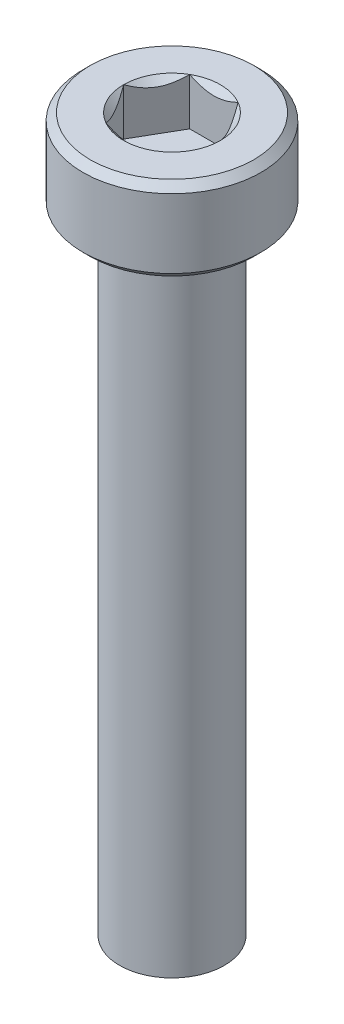
ISO-10303-21;
HEADER;
FILE_DESCRIPTION(('STEP AP214'),'2;1');
FILE_NAME('part.step','',(''),(''),'','','');
FILE_SCHEMA(('AUTOMOTIVE_DESIGN { 1 0 10303 214 1 1 1 1 }'));
ENDSEC;
DATA;
#1=APPLICATION_CONTEXT('core data for automotive mechanical design processes');
#2=APPLICATION_PROTOCOL_DEFINITION('international standard','automotive_design',2000,#1);
#3=PRODUCT_CONTEXT('',#1,'mechanical');
#4=PRODUCT('Part','Part','',(#3));
#5=PRODUCT_RELATED_PRODUCT_CATEGORY('part','',(#4));
#6=PRODUCT_DEFINITION_FORMATION('','',#4);
#7=PRODUCT_DEFINITION_CONTEXT('part definition',#1,'design');
#8=PRODUCT_DEFINITION('design','',#6,#7);
#9=PRODUCT_DEFINITION_SHAPE('','',#8);
#10=(LENGTH_UNIT() NAMED_UNIT(*) SI_UNIT(.MILLI.,.METRE.));
#11=(NAMED_UNIT(*) PLANE_ANGLE_UNIT() SI_UNIT($,.RADIAN.));
#12=(NAMED_UNIT(*) SI_UNIT($,.STERADIAN.) SOLID_ANGLE_UNIT());
#13=UNCERTAINTY_MEASURE_WITH_UNIT(LENGTH_MEASURE(1.E-05),#10,'distance_accuracy_value','');
#14=(GEOMETRIC_REPRESENTATION_CONTEXT(3) GLOBAL_UNCERTAINTY_ASSIGNED_CONTEXT((#13)) GLOBAL_UNIT_ASSIGNED_CONTEXT((#10,
#11,#12)) REPRESENTATION_CONTEXT('',''));
#15=CARTESIAN_POINT('',(0.,0.,0.));
#16=DIRECTION('',(0.,0.,1.));
#17=DIRECTION('',(1.,0.,0.));
#18=AXIS2_PLACEMENT_3D('',#15,#16,#17);
#19=CARTESIAN_POINT('',(0.,4.,0.));
#20=DIRECTION('',(0.,-1.,0.));
#21=DIRECTION('',(0.,0.,-1.));
#22=AXIS2_PLACEMENT_3D('',#19,#20,#21);
#23=CYLINDRICAL_SURFACE('',#22,4.25);
#24=CARTESIAN_POINT('',(0.,0.35,0.));
#25=DIRECTION('',(0.,1.,0.));
#26=DIRECTION('',(0.,0.,1.));
#27=AXIS2_PLACEMENT_3D('',#24,#25,#26);
#28=CIRCLE('',#27,4.25);
#29=CARTESIAN_POINT('',(0.,0.35,4.25));
#30=VERTEX_POINT('',#29);
#31=EDGE_CURVE('E192',#30,#30,#28,.T.);
#32=ORIENTED_EDGE('',*,*,#31,.T.);
#33=EDGE_LOOP('',(#32));
#34=FACE_BOUND('',#33,.T.);
#35=CARTESIAN_POINT('',(0.,3.65,0.));
#36=DIRECTION('',(0.,1.,0.));
#37=DIRECTION('',(0.,0.,1.));
#38=AXIS2_PLACEMENT_3D('',#35,#36,#37);
#39=CIRCLE('',#38,4.25);
#40=CARTESIAN_POINT('',(0.,3.65,4.25));
#41=VERTEX_POINT('',#40);
#42=EDGE_CURVE('E173',#41,#41,#39,.F.);
#43=ORIENTED_EDGE('',*,*,#42,.T.);
#44=EDGE_LOOP('',(#43));
#45=FACE_BOUND('',#44,.T.);
#46=ADVANCED_FACE('F32',(#34,#45),#23,.T.);
#47=CARTESIAN_POINT('',(0.,4.,0.));
#48=DIRECTION('',(0.,1.,0.));
#49=DIRECTION('',(0.,0.,1.));
#50=AXIS2_PLACEMENT_3D('',#47,#48,#49);
#51=PLANE('',#50);
#52=CARTESIAN_POINT('',(0.,4.,0.));
#53=DIRECTION('',(0.,1.,0.));
#54=DIRECTION('',(0.,0.,1.));
#55=AXIS2_PLACEMENT_3D('',#52,#53,#54);
#56=CIRCLE('',#55,3.9);
#57=CARTESIAN_POINT('',(0.,4.,3.9));
#58=VERTEX_POINT('',#57);
#59=EDGE_CURVE('E36',#58,#58,#56,.T.);
#60=ORIENTED_EDGE('',*,*,#59,.T.);
#61=EDGE_LOOP('',(#60));
#62=FACE_BOUND('',#61,.T.);
#63=CARTESIAN_POINT('',(0.,4.,0.));
#64=DIRECTION('',(0.,1.,0.));
#65=DIRECTION('',(0.,0.,1.));
#66=AXIS2_PLACEMENT_3D('',#63,#64,#65);
#67=CIRCLE('',#66,2.3094010767585);
#68=CARTESIAN_POINT('',(1.15470053837925,4.,2.));
#69=VERTEX_POINT('',#68);
#70=CARTESIAN_POINT('',(2.3094010767585,4.,0.));
#71=VERTEX_POINT('',#70);
#72=EDGE_CURVE('E47',#69,#71,#67,.T.);
#73=ORIENTED_EDGE('',*,*,#72,.F.);
#74=CARTESIAN_POINT('',(-1.15470053837925,4.,2.));
#75=VERTEX_POINT('',#74);
#76=EDGE_CURVE('E54',#75,#69,#67,.T.);
#77=ORIENTED_EDGE('',*,*,#76,.F.);
#78=CARTESIAN_POINT('',(-2.3094010767585,4.,0.));
#79=VERTEX_POINT('',#78);
#80=EDGE_CURVE('E221',#79,#75,#67,.T.);
#81=ORIENTED_EDGE('',*,*,#80,.F.);
#82=CARTESIAN_POINT('',(-1.15470053837925,4.,-2.));
#83=VERTEX_POINT('',#82);
#84=EDGE_CURVE('E275',#83,#79,#67,.T.);
#85=ORIENTED_EDGE('',*,*,#84,.F.);
#86=CARTESIAN_POINT('',(1.15470053837925,4.,-2.));
#87=VERTEX_POINT('',#86);
#88=EDGE_CURVE('E279',#87,#83,#67,.T.);
#89=ORIENTED_EDGE('',*,*,#88,.F.);
#90=EDGE_CURVE('E224',#71,#87,#67,.T.);
#91=ORIENTED_EDGE('',*,*,#90,.F.);
#92=EDGE_LOOP('',(#73,#77,#81,#85,#89,#91));
#93=FACE_BOUND('',#92,.T.);
#94=ADVANCED_FACE('F117',(#62,#93),#51,.T.);
#95=CARTESIAN_POINT('',(0.,0.,0.));
#96=DIRECTION('',(0.,1.,0.));
#97=DIRECTION('',(0.,0.,1.));
#98=AXIS2_PLACEMENT_3D('',#95,#96,#97);
#99=PLANE('',#98);
#100=CARTESIAN_POINT('',(0.,0.,0.));
#101=DIRECTION('',(0.,-1.,0.));
#102=DIRECTION('',(0.,0.,-1.));
#103=AXIS2_PLACEMENT_3D('',#100,#101,#102);
#104=CIRCLE('',#103,2.5);
#105=CARTESIAN_POINT('',(0.,0.,-2.5));
#106=VERTEX_POINT('',#105);
#107=EDGE_CURVE('E11',#106,#106,#104,.T.);
#108=ORIENTED_EDGE('',*,*,#107,.F.);
#109=EDGE_LOOP('',(#108));
#110=FACE_BOUND('',#109,.T.);
#111=CARTESIAN_POINT('',(0.,0.,0.));
#112=DIRECTION('',(0.,1.,0.));
#113=DIRECTION('',(0.,0.,1.));
#114=AXIS2_PLACEMENT_3D('',#111,#112,#113);
#115=CIRCLE('',#114,3.9);
#116=CARTESIAN_POINT('',(0.,0.,3.9));
#117=VERTEX_POINT('',#116);
#118=EDGE_CURVE('E193',#117,#117,#115,.F.);
#119=ORIENTED_EDGE('',*,*,#118,.T.);
#120=EDGE_LOOP('',(#119));
#121=FACE_BOUND('',#120,.T.);
#122=ADVANCED_FACE('F114',(#110,#121),#99,.F.);
#123=CARTESIAN_POINT('',(0.,4.,0.));
#124=DIRECTION('',(0.,1.,0.));
#125=DIRECTION('',(0.,0.,1.));
#126=AXIS2_PLACEMENT_3D('',#123,#124,#125);
#127=CONICAL_SURFACE('',#126,2.3094010767585,0.78539816339745);
#128=ORIENTED_EDGE('',*,*,#88,.T.);
#129=CARTESIAN_POINT('',(-2.30879514519547,4.7451913710941,-2.));
#130=CARTESIAN_POINT('',(-2.25260483420644,4.70272936243434,-2.));
#131=CARTESIAN_POINT('',(-2.19610054826954,4.66067688200341,-2.));
#132=CARTESIAN_POINT('',(-2.08233997644141,4.57757255324399,-2.));
#133=CARTESIAN_POINT('',(-2.02508350593089,4.53652095791472,-2.));
#134=CARTESIAN_POINT('',(-1.90927566541922,4.45530804643438,-2.));
#135=CARTESIAN_POINT('',(-1.85071770008489,4.41515609122241,-2.));
#136=CARTESIAN_POINT('',(-1.73260864093249,4.3363515847231,-2.));
#137=CARTESIAN_POINT('',(-1.67305761759535,4.29769892766731,-2.));
#138=CARTESIAN_POINT('',(-1.48577916730299,4.18010979954426,-2.));
#139=CARTESIAN_POINT('',(-1.35605368916015,4.10429897318513,-2.));
#140=CARTESIAN_POINT('',(-1.09012591699501,3.96558678933234,-2.));
#141=CARTESIAN_POINT('',(-0.953947448051695,3.90264190405374,-2.));
#142=CARTESIAN_POINT('',(-0.749595808101582,3.82563304479576,-2.));
#143=CARTESIAN_POINT('',(-0.68446185868507,3.80354078810321,-2.));
#144=CARTESIAN_POINT('',(-0.552616590705859,3.76458470124845,-2.));
#145=CARTESIAN_POINT('',(-0.485905164307167,3.74772122964342,-2.));
#146=CARTESIAN_POINT('',(-0.35242076182913,3.72038115809599,-2.));
#147=CARTESIAN_POINT('',(-0.285670630070522,3.70979477255778,-2.));
#148=CARTESIAN_POINT('',(-0.151450075115658,3.69521650264193,-2.));
#149=CARTESIAN_POINT('',(-0.0839797791079536,3.69122347258728,-2.));
#150=CARTESIAN_POINT('',(0.0485458836876959,3.69013056832569,-2.));
#151=CARTESIAN_POINT('',(0.113599297040325,3.69278385991794,-2.));
#152=CARTESIAN_POINT('',(0.243151501456514,3.7042913666304,-2.));
#153=CARTESIAN_POINT('',(0.307650238204749,3.71314618217543,-2.));
#154=CARTESIAN_POINT('',(0.436718068720302,3.73672255220297,-2.));
#155=CARTESIAN_POINT('',(0.501268607918767,3.75154414683371,-2.));
#156=CARTESIAN_POINT('',(0.62895874241765,3.78626456197787,-2.));
#157=CARTESIAN_POINT('',(0.692098453289582,3.80616296494129,-2.));
#158=CARTESIAN_POINT('',(0.890618825033236,3.87621951925558,-2.));
#159=CARTESIAN_POINT('',(1.02317938217928,3.9343452676672,-2.));
#160=CARTESIAN_POINT('',(1.28208571706617,4.06358808493712,-2.));
#161=CARTESIAN_POINT('',(1.40840705860453,4.1347517736225,-2.));
#162=CARTESIAN_POINT('',(1.59098608025607,4.245808104349,-2.));
#163=CARTESIAN_POINT('',(1.64922192266561,4.28251192905768,-2.));
#164=CARTESIAN_POINT('',(1.76469412690495,4.35747121364132,-2.));
#165=CARTESIAN_POINT('',(1.82193041260228,4.39572679097645,-2.));
#166=CARTESIAN_POINT('',(1.93507003138205,4.47318936346553,-2.));
#167=CARTESIAN_POINT('',(1.99098041312104,4.51238611495078,-2.));
#168=CARTESIAN_POINT('',(2.10203689890268,4.59181712257718,-2.));
#169=CARTESIAN_POINT('',(2.15718320893172,4.63205109038507,-2.));
#170=CARTESIAN_POINT('',(2.21200957179853,4.67270997847205,-2.));
#171=B_SPLINE_CURVE_WITH_KNOTS('',3,(#129,#130,#131,#132,#133,#134,#135,#136,#137,#138,#139,
#140,#141,#142,#143,#144,#145,#146,#147,#148,#149,#150,#151,#152,#153,#154,#155,#156,#157,#158,
#159,#160,#161,#162,#163,#164,#165,#166,#167,#168,#169,#170),.UNSPECIFIED.,.F.,.F.,(4,2,2,2,2,2,
2,2,2,2,2,2,2,2,2,2,2,2,2,2,4),(0.,0.211292968403538,0.422638804079875,0.635621962722851,
0.848590068976733,1.29896262331491,1.74778530247796,1.95394639565666,2.16012162294077,
2.36257550428405,2.56499420305935,2.76000764023076,2.95503996100237,3.15348829581996,
3.35192031420439,3.78488584147103,4.2194308621905,4.42592352930545,4.63243185619172,
4.83726388732872,5.04203957897375),.UNSPECIFIED.);
#172=EDGE_CURVE('E189',#87,#83,#171,.F.);
#173=ORIENTED_EDGE('',*,*,#172,.F.);
#174=EDGE_LOOP('',(#128,#173));
#175=FACE_BOUND('',#174,.T.);
#176=ADVANCED_FACE('F95',(#175),#127,.F.);
#177=ORIENTED_EDGE('',*,*,#84,.T.);
#178=CARTESIAN_POINT('',(-1.15458506832541,4.00011547871366,-2.0002));
#179=CARTESIAN_POINT('',(-1.19427965103065,3.96045309022559,-1.93144696596929));
#180=CARTESIAN_POINT('',(-1.23463799837204,3.92311998228416,-1.86154425786449));
#181=CARTESIAN_POINT('',(-1.31693321846145,3.85476368513614,-1.71900475544956));
#182=CARTESIAN_POINT('',(-1.35887791933134,3.82377853373722,-1.64635440243464));
#183=CARTESIAN_POINT('',(-1.44345742638069,3.77070021654414,-1.49985839894603));
#184=CARTESIAN_POINT('',(-1.48607068799507,3.74847362717661,-1.4260500647537));
#185=CARTESIAN_POINT('',(-1.57223542169503,3.71422881667508,-1.27680836816473));
#186=CARTESIAN_POINT('',(-1.61578426088223,3.70218502914413,-1.20137956608185));
#187=CARTESIAN_POINT('',(-1.69083694766536,3.69131851190557,-1.07138449932892));
#188=CARTESIAN_POINT('',(-1.72224381117151,3.68970975360997,-1.01698621602989));
#189=CARTESIAN_POINT('',(-1.78500621460364,3.69241887759871,-0.908278544480304));
#190=CARTESIAN_POINT('',(-1.81636173267754,3.69673883775797,-0.853969194078659));
#191=CARTESIAN_POINT('',(-1.87877671565355,3.71105956740991,-0.74586327241066));
#192=CARTESIAN_POINT('',(-1.90983580972306,3.72106669276201,-0.692067343445206));
#193=CARTESIAN_POINT('',(-1.97141691651548,3.74621243024966,-0.585405737694424));
#194=CARTESIAN_POINT('',(-2.00193897021859,3.76135064904224,-0.532539989929285));
#195=CARTESIAN_POINT('',(-2.08012358375727,3.80629450342919,-0.397120266910154));
#196=CARTESIAN_POINT('',(-2.12730124240478,3.83948883942582,-0.315406165150521));
#197=CARTESIAN_POINT('',(-2.19667172615922,3.89552582317137,-0.195252962742198));
#198=CARTESIAN_POINT('',(-2.21953238052245,3.91521470294694,-0.155657147890823));
#199=CARTESIAN_POINT('',(-2.26483018959123,3.95638731836487,-0.0771990411121286));
#200=CARTESIAN_POINT('',(-2.28726759416161,3.97786995165125,-0.0383363164062609));
#201=CARTESIAN_POINT('',(-2.30951654681234,4.00011547871366,0.000199999999998398));
#202=B_SPLINE_CURVE_WITH_KNOTS('',3,(#178,#179,#180,#181,#182,#183,#184,#185,#186,#187,#188,
#189,#190,#191,#192,#193,#194,#195,#196,#197,#198,#199,#200,#201),.UNSPECIFIED.,.F.,.F.,(4,2,2,
2,2,2,2,2,2,2,2,4),(0.,0.266420613771064,0.534393751523389,0.798110374376916,1.06116288956937,
1.24939906803722,1.43770123566248,1.62621426093932,1.81471283831913,2.11415604834145,
2.2634717071779,2.4126962696977),.UNSPECIFIED.);
#203=EDGE_CURVE('E231',#83,#79,#202,.T.);
#204=ORIENTED_EDGE('',*,*,#203,.F.);
#205=EDGE_LOOP('',(#177,#204));
#206=FACE_BOUND('',#205,.T.);
#207=ADVANCED_FACE('F113',(#206),#127,.F.);
#208=ORIENTED_EDGE('',*,*,#80,.T.);
#209=CARTESIAN_POINT('',(-2.30951654681234,4.00011547871366,-0.000200000000001262));
#210=CARTESIAN_POINT('',(-2.26982196410711,3.96045309022559,0.0685530340307045));
#211=CARTESIAN_POINT('',(-2.22946361676572,3.92311998228416,0.138455742135511));
#212=CARTESIAN_POINT('',(-2.1471683966763,3.85476368513614,0.280995244550435));
#213=CARTESIAN_POINT('',(-2.10522369580642,3.82377853373722,0.353645597565357));
#214=CARTESIAN_POINT('',(-2.02064418875706,3.77070021654414,0.50014160105397));
#215=CARTESIAN_POINT('',(-1.97803092714269,3.74847362717661,0.573949935246294));
#216=CARTESIAN_POINT('',(-1.89186619344273,3.71422881667508,0.723191631835263));
#217=CARTESIAN_POINT('',(-1.84831735425552,3.70218502914413,0.798620433918151));
#218=CARTESIAN_POINT('',(-1.7732646674724,3.69131851190557,0.928615500671078));
#219=CARTESIAN_POINT('',(-1.74185780396625,3.68970975360997,0.983013783970107));
#220=CARTESIAN_POINT('',(-1.67909540053412,3.69241887759871,1.09172145551969));
#221=CARTESIAN_POINT('',(-1.64773988246021,3.69673883775797,1.14603080592134));
#222=CARTESIAN_POINT('',(-1.5853248994842,3.7110595674099,1.25413672758934));
#223=CARTESIAN_POINT('',(-1.55426580541469,3.721066692762,1.30793265655479));
#224=CARTESIAN_POINT('',(-1.49268469862228,3.74621243024966,1.41459426230557));
#225=CARTESIAN_POINT('',(-1.46216264491917,3.76135064904224,1.46746001007071));
#226=CARTESIAN_POINT('',(-1.38397803138049,3.80629450342919,1.60287973308984));
#227=CARTESIAN_POINT('',(-1.33680037273297,3.83948883942582,1.68459383484948));
#228=CARTESIAN_POINT('',(-1.26742988897853,3.89552582317137,1.8047470372578));
#229=CARTESIAN_POINT('',(-1.24456923461531,3.91521470294694,1.84434285210918));
#230=CARTESIAN_POINT('',(-1.19927142554652,3.95638731836487,1.92280095888787));
#231=CARTESIAN_POINT('',(-1.17683402097614,3.97786995165125,1.96166368359374));
#232=CARTESIAN_POINT('',(-1.15458506832541,4.00011547871366,2.0002));
#233=B_SPLINE_CURVE_WITH_KNOTS('',3,(#209,#210,#211,#212,#213,#214,#215,#216,#217,#218,#219,
#220,#221,#222,#223,#224,#225,#226,#227,#228,#229,#230,#231,#232),.UNSPECIFIED.,.F.,.F.,(4,2,2,
2,2,2,2,2,2,2,2,4),(0.,0.266420613771064,0.534393751523389,0.798110374376915,1.06116288956936,
1.24939906803722,1.43770123566247,1.62621426093932,1.81471283831913,2.11415604834145,
2.26347170717791,2.41269626969771),.UNSPECIFIED.);
#234=EDGE_CURVE('E238',#79,#75,#233,.T.);
#235=ORIENTED_EDGE('',*,*,#234,.F.);
#236=EDGE_LOOP('',(#208,#235));
#237=FACE_BOUND('',#236,.T.);
#238=ADVANCED_FACE('F273',(#237),#127,.F.);
#239=ORIENTED_EDGE('',*,*,#76,.T.);
#240=CARTESIAN_POINT('',(-2.30879514519547,4.7451913710941,2.));
#241=CARTESIAN_POINT('',(-2.25260483420644,4.70272936243434,2.));
#242=CARTESIAN_POINT('',(-2.19610054826953,4.66067688200341,2.));
#243=CARTESIAN_POINT('',(-2.0823399764414,4.57757255324399,2.));
#244=CARTESIAN_POINT('',(-2.02508350593089,4.53652095791471,2.));
#245=CARTESIAN_POINT('',(-1.90927566541922,4.45530804643438,2.));
#246=CARTESIAN_POINT('',(-1.85071770008489,4.41515609122241,2.));
#247=CARTESIAN_POINT('',(-1.73260864093249,4.3363515847231,2.));
#248=CARTESIAN_POINT('',(-1.67305761759535,4.29769892766731,2.));
#249=CARTESIAN_POINT('',(-1.48577916730299,4.18010979954426,2.));
#250=CARTESIAN_POINT('',(-1.35605368916015,4.10429897318513,2.));
#251=CARTESIAN_POINT('',(-1.09012591699501,3.96558678933234,2.));
#252=CARTESIAN_POINT('',(-0.953947448051694,3.90264190405374,2.));
#253=CARTESIAN_POINT('',(-0.749595808101582,3.82563304479576,2.));
#254=CARTESIAN_POINT('',(-0.68446185868507,3.80354078810321,2.));
#255=CARTESIAN_POINT('',(-0.552616590705859,3.76458470124845,2.));
#256=CARTESIAN_POINT('',(-0.485905164307167,3.74772122964342,2.));
#257=CARTESIAN_POINT('',(-0.352420761829129,3.72038115809599,2.));
#258=CARTESIAN_POINT('',(-0.285670630070522,3.70979477255778,2.));
#259=CARTESIAN_POINT('',(-0.151450075115657,3.69521650264193,2.));
#260=CARTESIAN_POINT('',(-0.0839797791079529,3.69122347258728,2.));
#261=CARTESIAN_POINT('',(0.0485458836876966,3.69013056832569,2.));
#262=CARTESIAN_POINT('',(0.113599297040325,3.69278385991794,2.));
#263=CARTESIAN_POINT('',(0.243151501456515,3.7042913666304,2.));
#264=CARTESIAN_POINT('',(0.307650238204749,3.71314618217543,2.));
#265=CARTESIAN_POINT('',(0.436718068720302,3.73672255220297,2.));
#266=CARTESIAN_POINT('',(0.501268607918768,3.75154414683371,2.));
#267=CARTESIAN_POINT('',(0.62895874241765,3.78626456197787,2.));
#268=CARTESIAN_POINT('',(0.692098453289583,3.80616296494129,2.));
#269=CARTESIAN_POINT('',(0.890618825033236,3.87621951925558,2.));
#270=CARTESIAN_POINT('',(1.02317938217928,3.9343452676672,2.));
#271=CARTESIAN_POINT('',(1.28208571706617,4.06358808493712,2.));
#272=CARTESIAN_POINT('',(1.40840705860453,4.1347517736225,2.));
#273=CARTESIAN_POINT('',(1.59098608025607,4.24580810434899,2.));
#274=CARTESIAN_POINT('',(1.64922192266561,4.28251192905768,2.));
#275=CARTESIAN_POINT('',(1.76469412690495,4.35747121364132,2.));
#276=CARTESIAN_POINT('',(1.82193041260228,4.39572679097644,2.));
#277=CARTESIAN_POINT('',(1.93507003138205,4.47318936346553,2.));
#278=CARTESIAN_POINT('',(1.99098041312104,4.51238611495078,2.));
#279=CARTESIAN_POINT('',(2.10203689890268,4.59181712257718,2.));
#280=CARTESIAN_POINT('',(2.15718320893172,4.63205109038507,2.));
#281=CARTESIAN_POINT('',(2.21200957179853,4.67270997847205,2.));
#282=B_SPLINE_CURVE_WITH_KNOTS('',3,(#240,#241,#242,#243,#244,#245,#246,#247,#248,#249,#250,
#251,#252,#253,#254,#255,#256,#257,#258,#259,#260,#261,#262,#263,#264,#265,#266,#267,#268,#269,
#270,#271,#272,#273,#274,#275,#276,#277,#278,#279,#280,#281),.UNSPECIFIED.,.F.,.F.,(4,2,2,2,2,2,
2,2,2,2,2,2,2,2,2,2,2,2,2,2,4),(0.,0.211292968403538,0.422638804079876,0.63562196272285,
0.848590068976733,1.29896262331491,1.74778530247796,1.95394639565666,2.16012162294077,
2.36257550428405,2.56499420305935,2.76000764023076,2.95503996100237,3.15348829581996,
3.35192031420438,3.78488584147103,4.2194308621905,4.42592352930545,4.63243185619172,
4.83726388732871,5.04203957897375),.UNSPECIFIED.);
#283=EDGE_CURVE('E258',#75,#69,#282,.T.);
#284=ORIENTED_EDGE('',*,*,#283,.F.);
#285=EDGE_LOOP('',(#239,#284));
#286=FACE_BOUND('',#285,.T.);
#287=ADVANCED_FACE('F272',(#286),#127,.F.);
#288=ORIENTED_EDGE('',*,*,#72,.T.);
#289=CARTESIAN_POINT('',(1.15458506832541,4.00011547871366,2.0002));
#290=CARTESIAN_POINT('',(1.19427965103064,3.96045309022559,1.93144696596929));
#291=CARTESIAN_POINT('',(1.23463799837204,3.92311998228416,1.86154425786449));
#292=CARTESIAN_POINT('',(1.31693321846145,3.85476368513614,1.71900475544956));
#293=CARTESIAN_POINT('',(1.35887791933134,3.82377853373722,1.64635440243464));
#294=CARTESIAN_POINT('',(1.44345742638069,3.77070021654414,1.49985839894603));
#295=CARTESIAN_POINT('',(1.48607068799507,3.74847362717661,1.42605006475371));
#296=CARTESIAN_POINT('',(1.57223542169503,3.71422881667508,1.27680836816474));
#297=CARTESIAN_POINT('',(1.61578426088223,3.70218502914413,1.20137956608185));
#298=CARTESIAN_POINT('',(1.69083694766536,3.69131851190557,1.07138449932892));
#299=CARTESIAN_POINT('',(1.72224381117151,3.68970975360997,1.01698621602989));
#300=CARTESIAN_POINT('',(1.78500621460364,3.69241887759871,0.908278544480306));
#301=CARTESIAN_POINT('',(1.81636173267754,3.69673883775797,0.85396919407866));
#302=CARTESIAN_POINT('',(1.87877671565355,3.71105956740991,0.745863272410661));
#303=CARTESIAN_POINT('',(1.90983580972306,3.72106669276201,0.692067343445207));
#304=CARTESIAN_POINT('',(1.97141691651548,3.74621243024966,0.585405737694425));
#305=CARTESIAN_POINT('',(2.00193897021859,3.76135064904224,0.532539989929286));
#306=CARTESIAN_POINT('',(2.08012358375727,3.80629450342919,0.397120266910155));
#307=CARTESIAN_POINT('',(2.12730124240478,3.83948883942582,0.315406165150521));
#308=CARTESIAN_POINT('',(2.19667172615922,3.89552582317137,0.195252962742197));
#309=CARTESIAN_POINT('',(2.21953238052245,3.91521470294694,0.155657147890823));
#310=CARTESIAN_POINT('',(2.26483018959124,3.95638731836487,0.0771990411121278));
#311=CARTESIAN_POINT('',(2.28726759416161,3.97786995165125,0.0383363164062597));
#312=CARTESIAN_POINT('',(2.30951654681234,4.00011547871366,-0.000200000000000139));
#313=B_SPLINE_CURVE_WITH_KNOTS('',3,(#289,#290,#291,#292,#293,#294,#295,#296,#297,#298,#299,
#300,#301,#302,#303,#304,#305,#306,#307,#308,#309,#310,#311,#312),.UNSPECIFIED.,.F.,.F.,(4,2,2,
2,2,2,2,2,2,2,2,4),(0.,0.266420613771064,0.534393751523389,0.798110374376915,1.06116288956936,
1.24939906803722,1.43770123566248,1.62621426093932,1.81471283831913,2.11415604834145,
2.2634717071779,2.41269626969771),.UNSPECIFIED.);
#314=EDGE_CURVE('E145',#69,#71,#313,.T.);
#315=ORIENTED_EDGE('',*,*,#314,.F.);
#316=EDGE_LOOP('',(#288,#315));
#317=FACE_BOUND('',#316,.T.);
#318=ADVANCED_FACE('F110',(#317),#127,.F.);
#319=ORIENTED_EDGE('',*,*,#90,.T.);
#320=CARTESIAN_POINT('',(2.30951654681234,4.00011547871366,0.000199999999999522));
#321=CARTESIAN_POINT('',(2.26982196410711,3.96045309022559,-0.0685530340307061));
#322=CARTESIAN_POINT('',(2.22946361676572,3.92311998228416,-0.138455742135512));
#323=CARTESIAN_POINT('',(2.1471683966763,3.85476368513614,-0.280995244550437));
#324=CARTESIAN_POINT('',(2.10522369580642,3.82377853373722,-0.353645597565359));
#325=CARTESIAN_POINT('',(2.02064418875706,3.77070021654414,-0.500141601053972));
#326=CARTESIAN_POINT('',(1.97803092714269,3.74847362717661,-0.573949935246295));
#327=CARTESIAN_POINT('',(1.89186619344273,3.71422881667508,-0.723191631835264));
#328=CARTESIAN_POINT('',(1.84831735425552,3.70218502914413,-0.798620433918152));
#329=CARTESIAN_POINT('',(1.7732646674724,3.69131851190557,-0.928615500671079));
#330=CARTESIAN_POINT('',(1.74185780396625,3.68970975360997,-0.983013783970109));
#331=CARTESIAN_POINT('',(1.67909540053412,3.69241887759871,-1.09172145551969));
#332=CARTESIAN_POINT('',(1.64773988246021,3.69673883775797,-1.14603080592134));
#333=CARTESIAN_POINT('',(1.5853248994842,3.71105956740991,-1.25413672758934));
#334=CARTESIAN_POINT('',(1.55426580541469,3.72106669276201,-1.30793265655479));
#335=CARTESIAN_POINT('',(1.49268469862228,3.74621243024966,-1.41459426230557));
#336=CARTESIAN_POINT('',(1.46216264491917,3.76135064904224,-1.46746001007071));
#337=CARTESIAN_POINT('',(1.38397803138049,3.80629450342919,-1.60287973308984));
#338=CARTESIAN_POINT('',(1.33680037273297,3.83948883942582,-1.68459383484948));
#339=CARTESIAN_POINT('',(1.26742988897853,3.89552582317137,-1.8047470372578));
#340=CARTESIAN_POINT('',(1.24456923461531,3.91521470294694,-1.84434285210918));
#341=CARTESIAN_POINT('',(1.19927142554652,3.95638731836487,-1.92280095888787));
#342=CARTESIAN_POINT('',(1.17683402097614,3.97786995165125,-1.96166368359374));
#343=CARTESIAN_POINT('',(1.15458506832541,4.00011547871366,-2.0002));
#344=B_SPLINE_CURVE_WITH_KNOTS('',3,(#320,#321,#322,#323,#324,#325,#326,#327,#328,#329,#330,
#331,#332,#333,#334,#335,#336,#337,#338,#339,#340,#341,#342,#343),.UNSPECIFIED.,.F.,.F.,(4,2,2,
2,2,2,2,2,2,2,2,4),(0.,0.266420613771064,0.534393751523388,0.798110374376914,1.06116288956936,
1.24939906803722,1.43770123566247,1.62621426093932,1.81471283831913,2.11415604834145,
2.2634717071779,2.41269626969771),.UNSPECIFIED.);
#345=EDGE_CURVE('E136',#71,#87,#344,.T.);
#346=ORIENTED_EDGE('',*,*,#345,.F.);
#347=EDGE_LOOP('',(#319,#346));
#348=FACE_BOUND('',#347,.T.);
#349=ADVANCED_FACE('F94',(#348),#127,.F.);
#350=CARTESIAN_POINT('',(0.,1.75,0.));
#351=DIRECTION('',(0.,1.,0.));
#352=DIRECTION('',(0.,0.,1.));
#353=AXIS2_PLACEMENT_3D('',#350,#351,#352);
#354=PLANE('',#353);
#355=CARTESIAN_POINT('',(0.,1.75,0.));
#356=DIRECTION('',(0.,1.,0.));
#357=DIRECTION('',(0.,0.,1.));
#358=AXIS2_PLACEMENT_3D('',#355,#356,#357);
#359=CIRCLE('',#358,0.059401076758495);
#360=CARTESIAN_POINT('',(0.,1.75,0.059401076758495));
#361=VERTEX_POINT('',#360);
#362=EDGE_CURVE('E187',#361,#361,#359,.T.);
#363=ORIENTED_EDGE('',*,*,#362,.F.);
#364=EDGE_LOOP('',(#363));
#365=FACE_BOUND('',#364,.T.);
#366=DIRECTION('',(-0.5,0.,-0.866025403784439));
#367=VECTOR('',#366,1.);
#368=CARTESIAN_POINT('',(2.3094010767585,1.75,0.));
#369=LINE('',#368,#367);
#370=CARTESIAN_POINT('',(2.3094010767585,1.75,0.));
#371=VERTEX_POINT('',#370);
#372=CARTESIAN_POINT('',(1.15470053837925,1.75,-2.));
#373=VERTEX_POINT('',#372);
#374=EDGE_CURVE('E144',#371,#373,#369,.T.);
#375=ORIENTED_EDGE('',*,*,#374,.T.);
#376=DIRECTION('',(-1.,0.,0.));
#377=VECTOR('',#376,1.);
#378=CARTESIAN_POINT('',(1.15470053837925,1.75,-2.));
#379=LINE('',#378,#377);
#380=CARTESIAN_POINT('',(-1.15470053837925,1.75,-2.));
#381=VERTEX_POINT('',#380);
#382=EDGE_CURVE('E154',#373,#381,#379,.T.);
#383=ORIENTED_EDGE('',*,*,#382,.T.);
#384=DIRECTION('',(-0.5,0.,0.866025403784439));
#385=VECTOR('',#384,1.);
#386=CARTESIAN_POINT('',(-1.15470053837925,1.75,-2.));
#387=LINE('',#386,#385);
#388=CARTESIAN_POINT('',(-2.3094010767585,1.75,0.));
#389=VERTEX_POINT('',#388);
#390=EDGE_CURVE('E157',#381,#389,#387,.T.);
#391=ORIENTED_EDGE('',*,*,#390,.T.);
#392=DIRECTION('',(0.5,0.,0.866025403784439));
#393=VECTOR('',#392,1.);
#394=CARTESIAN_POINT('',(-2.3094010767585,1.75,0.));
#395=LINE('',#394,#393);
#396=CARTESIAN_POINT('',(-1.15470053837925,1.75,2.));
#397=VERTEX_POINT('',#396);
#398=EDGE_CURVE('E160',#389,#397,#395,.T.);
#399=ORIENTED_EDGE('',*,*,#398,.T.);
#400=DIRECTION('',(1.,0.,0.));
#401=VECTOR('',#400,1.);
#402=CARTESIAN_POINT('',(-1.15470053837925,1.75,2.));
#403=LINE('',#402,#401);
#404=CARTESIAN_POINT('',(1.15470053837925,1.75,2.));
#405=VERTEX_POINT('',#404);
#406=EDGE_CURVE('E163',#397,#405,#403,.T.);
#407=ORIENTED_EDGE('',*,*,#406,.T.);
#408=DIRECTION('',(0.5,0.,-0.866025403784439));
#409=VECTOR('',#408,1.);
#410=CARTESIAN_POINT('',(1.15470053837925,1.75,2.));
#411=LINE('',#410,#409);
#412=EDGE_CURVE('E166',#405,#371,#411,.T.);
#413=ORIENTED_EDGE('',*,*,#412,.T.);
#414=EDGE_LOOP('',(#375,#383,#391,#399,#407,#413));
#415=FACE_BOUND('',#414,.T.);
#416=ADVANCED_FACE('F109',(#365,#415),#354,.T.);
#417=CARTESIAN_POINT('',(1.15470053837925,1.75,-2.));
#418=DIRECTION('',(0.,0.,-1.));
#419=DIRECTION('',(-1.,0.,0.));
#420=AXIS2_PLACEMENT_3D('',#417,#418,#419);
#421=PLANE('',#420);
#422=DIRECTION('',(0.,1.,0.));
#423=VECTOR('',#422,1.);
#424=CARTESIAN_POINT('',(1.15470053837925,1.75,-2.));
#425=LINE('',#424,#423);
#426=EDGE_CURVE('E169',#373,#87,#425,.T.);
#427=ORIENTED_EDGE('',*,*,#426,.T.);
#428=ORIENTED_EDGE('',*,*,#172,.T.);
#429=DIRECTION('',(0.,1.,0.));
#430=VECTOR('',#429,1.);
#431=CARTESIAN_POINT('',(-1.15470053837925,1.75,-2.));
#432=LINE('',#431,#430);
#433=EDGE_CURVE('E182',#381,#83,#432,.T.);
#434=ORIENTED_EDGE('',*,*,#433,.F.);
#435=ORIENTED_EDGE('',*,*,#382,.F.);
#436=EDGE_LOOP('',(#427,#428,#434,#435));
#437=FACE_BOUND('',#436,.T.);
#438=ADVANCED_FACE('F132',(#437),#421,.F.);
#439=CARTESIAN_POINT('',(-1.15470053837925,1.75,-2.));
#440=DIRECTION('',(-0.866025403784439,0.,-0.5));
#441=DIRECTION('',(-0.5,0.,0.866025403784439));
#442=AXIS2_PLACEMENT_3D('',#439,#440,#441);
#443=PLANE('',#442);
#444=ORIENTED_EDGE('',*,*,#433,.T.);
#445=ORIENTED_EDGE('',*,*,#203,.T.);
#446=DIRECTION('',(0.,1.,0.));
#447=VECTOR('',#446,1.);
#448=CARTESIAN_POINT('',(-2.3094010767585,1.75,0.));
#449=LINE('',#448,#447);
#450=EDGE_CURVE('E179',#389,#79,#449,.T.);
#451=ORIENTED_EDGE('',*,*,#450,.F.);
#452=ORIENTED_EDGE('',*,*,#390,.F.);
#453=EDGE_LOOP('',(#444,#445,#451,#452));
#454=FACE_BOUND('',#453,.T.);
#455=ADVANCED_FACE('F244',(#454),#443,.F.);
#456=CARTESIAN_POINT('',(-2.3094010767585,1.75,0.));
#457=DIRECTION('',(-0.866025403784439,0.,0.5));
#458=DIRECTION('',(0.5,0.,0.866025403784439));
#459=AXIS2_PLACEMENT_3D('',#456,#457,#458);
#460=PLANE('',#459);
#461=ORIENTED_EDGE('',*,*,#450,.T.);
#462=ORIENTED_EDGE('',*,*,#234,.T.);
#463=DIRECTION('',(0.,1.,0.));
#464=VECTOR('',#463,1.);
#465=CARTESIAN_POINT('',(-1.15470053837925,1.75,2.));
#466=LINE('',#465,#464);
#467=EDGE_CURVE('E177',#397,#75,#466,.T.);
#468=ORIENTED_EDGE('',*,*,#467,.F.);
#469=ORIENTED_EDGE('',*,*,#398,.F.);
#470=EDGE_LOOP('',(#461,#462,#468,#469));
#471=FACE_BOUND('',#470,.T.);
#472=ADVANCED_FACE('F247',(#471),#460,.F.);
#473=CARTESIAN_POINT('',(-1.15470053837925,1.75,2.));
#474=DIRECTION('',(0.,0.,1.));
#475=DIRECTION('',(1.,0.,0.));
#476=AXIS2_PLACEMENT_3D('',#473,#474,#475);
#477=PLANE('',#476);
#478=ORIENTED_EDGE('',*,*,#467,.T.);
#479=ORIENTED_EDGE('',*,*,#283,.T.);
#480=DIRECTION('',(0.,1.,0.));
#481=VECTOR('',#480,1.);
#482=CARTESIAN_POINT('',(1.15470053837925,1.75,2.));
#483=LINE('',#482,#481);
#484=EDGE_CURVE('E174',#405,#69,#483,.T.);
#485=ORIENTED_EDGE('',*,*,#484,.F.);
#486=ORIENTED_EDGE('',*,*,#406,.F.);
#487=EDGE_LOOP('',(#478,#479,#485,#486));
#488=FACE_BOUND('',#487,.T.);
#489=ADVANCED_FACE('F252',(#488),#477,.F.);
#490=CARTESIAN_POINT('',(1.15470053837925,1.75,2.));
#491=DIRECTION('',(0.866025403784439,0.,0.5));
#492=DIRECTION('',(0.5,0.,-0.866025403784439));
#493=AXIS2_PLACEMENT_3D('',#490,#491,#492);
#494=PLANE('',#493);
#495=ORIENTED_EDGE('',*,*,#484,.T.);
#496=ORIENTED_EDGE('',*,*,#314,.T.);
#497=DIRECTION('',(0.,1.,0.));
#498=VECTOR('',#497,1.);
#499=CARTESIAN_POINT('',(2.3094010767585,1.75,0.));
#500=LINE('',#499,#498);
#501=EDGE_CURVE('E170',#371,#71,#500,.T.);
#502=ORIENTED_EDGE('',*,*,#501,.F.);
#503=ORIENTED_EDGE('',*,*,#412,.F.);
#504=EDGE_LOOP('',(#495,#496,#502,#503));
#505=FACE_BOUND('',#504,.T.);
#506=ADVANCED_FACE('F101',(#505),#494,.F.);
#507=CARTESIAN_POINT('',(2.3094010767585,1.75,0.));
#508=DIRECTION('',(0.866025403784439,0.,-0.5));
#509=DIRECTION('',(-0.5,0.,-0.866025403784439));
#510=AXIS2_PLACEMENT_3D('',#507,#508,#509);
#511=PLANE('',#510);
#512=ORIENTED_EDGE('',*,*,#501,.T.);
#513=ORIENTED_EDGE('',*,*,#345,.T.);
#514=ORIENTED_EDGE('',*,*,#426,.F.);
#515=ORIENTED_EDGE('',*,*,#374,.F.);
#516=EDGE_LOOP('',(#512,#513,#514,#515));
#517=FACE_BOUND('',#516,.T.);
#518=ADVANCED_FACE('F91',(#517),#511,.F.);
#519=ORIENTED_EDGE('',*,*,#362,.T.);
#520=EDGE_LOOP('',(#519));
#521=FACE_BOUND('',#520,.T.);
#522=CARTESIAN_POINT('',(0.,1.69059892324151,0.));
#523=VERTEX_POINT('',#522);
#524=VERTEX_LOOP('',#523);
#525=FACE_BOUND('',#524,.T.);
#526=ADVANCED_FACE('F88',(#521,#525),#127,.F.);
#527=CARTESIAN_POINT('',(0.,0.35,0.));
#528=DIRECTION('',(0.,1.,0.));
#529=DIRECTION('',(0.,0.,1.));
#530=AXIS2_PLACEMENT_3D('',#527,#528,#529);
#531=CONICAL_SURFACE('',#530,4.25,0.78539816339745);
#532=CARTESIAN_POINT('',(0.,0.,3.9));
#533=CARTESIAN_POINT('',(0.,0.00364583333333348,3.90364583333333));
#534=CARTESIAN_POINT('',(0.,0.00729166666666674,3.90729166666667));
#535=CARTESIAN_POINT('',(0.,0.0145833333333333,3.91458333333333));
#536=CARTESIAN_POINT('',(0.,0.0182291666666665,3.91822916666667));
#537=CARTESIAN_POINT('',(0.,0.0255208333333332,3.92552083333333));
#538=CARTESIAN_POINT('',(0.,0.0291666666666665,3.92916666666667));
#539=CARTESIAN_POINT('',(0.,0.0364583333333333,3.93645833333333));
#540=CARTESIAN_POINT('',(0.,0.0401041666666667,3.94010416666667));
#541=CARTESIAN_POINT('',(0.,0.0473958333333333,3.94739583333333));
#542=CARTESIAN_POINT('',(0.,0.0510416666666665,3.95104166666667));
#543=CARTESIAN_POINT('',(0.,0.0583333333333331,3.95833333333333));
#544=CARTESIAN_POINT('',(0.,0.0619791666666666,3.96197916666667));
#545=CARTESIAN_POINT('',(0.,0.0692708333333333,3.96927083333333));
#546=CARTESIAN_POINT('',(0.,0.0729166666666665,3.97291666666667));
#547=CARTESIAN_POINT('',(0.,0.0802083333333331,3.98020833333333));
#548=CARTESIAN_POINT('',(0.,0.0838541666666666,3.98385416666667));
#549=CARTESIAN_POINT('',(0.,0.0911458333333333,3.99114583333333));
#550=CARTESIAN_POINT('',(0.,0.0947916666666665,3.99479166666667));
#551=CARTESIAN_POINT('',(0.,0.102083333333333,4.00208333333333));
#552=CARTESIAN_POINT('',(0.,0.105729166666666,4.00572916666667));
#553=CARTESIAN_POINT('',(0.,0.113020833333333,4.01302083333333));
#554=CARTESIAN_POINT('',(0.,0.116666666666667,4.01666666666667));
#555=CARTESIAN_POINT('',(0.,0.123958333333333,4.02395833333333));
#556=CARTESIAN_POINT('',(0.,0.127604166666666,4.02760416666667));
#557=CARTESIAN_POINT('',(0.,0.134895833333333,4.03489583333333));
#558=CARTESIAN_POINT('',(0.,0.138541666666667,4.03854166666667));
#559=CARTESIAN_POINT('',(0.,0.145833333333333,4.04583333333333));
#560=CARTESIAN_POINT('',(0.,0.149479166666666,4.04947916666667));
#561=CARTESIAN_POINT('',(0.,0.156770833333333,4.05677083333333));
#562=CARTESIAN_POINT('',(0.,0.160416666666666,4.06041666666667));
#563=CARTESIAN_POINT('',(0.,0.167708333333333,4.06770833333333));
#564=CARTESIAN_POINT('',(0.,0.171354166666667,4.07135416666667));
#565=CARTESIAN_POINT('',(0.,0.178645833333333,4.07864583333333));
#566=CARTESIAN_POINT('',(0.,0.182291666666666,4.08229166666667));
#567=CARTESIAN_POINT('',(0.,0.189583333333333,4.08958333333333));
#568=CARTESIAN_POINT('',(0.,0.193229166666666,4.09322916666667));
#569=CARTESIAN_POINT('',(0.,0.200520833333333,4.10052083333333));
#570=CARTESIAN_POINT('',(0.,0.204166666666666,4.10416666666667));
#571=CARTESIAN_POINT('',(0.,0.211458333333333,4.11145833333333));
#572=CARTESIAN_POINT('',(0.,0.215104166666666,4.11510416666667));
#573=CARTESIAN_POINT('',(0.,0.222395833333333,4.12239583333333));
#574=CARTESIAN_POINT('',(0.,0.226041666666666,4.12604166666667));
#575=CARTESIAN_POINT('',(0.,0.233333333333333,4.13333333333333));
#576=CARTESIAN_POINT('',(0.,0.236979166666666,4.13697916666667));
#577=CARTESIAN_POINT('',(0.,0.244270833333333,4.14427083333333));
#578=CARTESIAN_POINT('',(0.,0.247916666666666,4.14791666666667));
#579=CARTESIAN_POINT('',(0.,0.255208333333333,4.15520833333333));
#580=CARTESIAN_POINT('',(0.,0.258854166666666,4.15885416666667));
#581=CARTESIAN_POINT('',(0.,0.266145833333333,4.16614583333333));
#582=CARTESIAN_POINT('',(0.,0.269791666666666,4.16979166666667));
#583=CARTESIAN_POINT('',(0.,0.277083333333333,4.17708333333333));
#584=CARTESIAN_POINT('',(0.,0.280729166666666,4.18072916666667));
#585=CARTESIAN_POINT('',(0.,0.288020833333333,4.18802083333333));
#586=CARTESIAN_POINT('',(0.,0.291666666666666,4.19166666666667));
#587=CARTESIAN_POINT('',(0.,0.298958333333333,4.19895833333333));
#588=CARTESIAN_POINT('',(0.,0.302604166666666,4.20260416666667));
#589=CARTESIAN_POINT('',(0.,0.309895833333333,4.20989583333333));
#590=CARTESIAN_POINT('',(0.,0.313541666666666,4.21354166666667));
#591=CARTESIAN_POINT('',(0.,0.320833333333333,4.22083333333333));
#592=CARTESIAN_POINT('',(0.,0.324479166666666,4.22447916666667));
#593=CARTESIAN_POINT('',(0.,0.331770833333333,4.23177083333333));
#594=CARTESIAN_POINT('',(0.,0.335416666666666,4.23541666666667));
#595=CARTESIAN_POINT('',(0.,0.342708333333333,4.24270833333333));
#596=CARTESIAN_POINT('',(0.,0.346354166666666,4.24635416666667));
#597=CARTESIAN_POINT('',(0.,0.35,4.25));
#598=B_SPLINE_CURVE_WITH_KNOTS('',3,(#532,#533,#534,#535,#536,#537,#538,#539,#540,#541,#542,
#543,#544,#545,#546,#547,#548,#549,#550,#551,#552,#553,#554,#555,#556,#557,#558,#559,#560,#561,
#562,#563,#564,#565,#566,#567,#568,#569,#570,#571,#572,#573,#574,#575,#576,#577,#578,#579,#580,
#581,#582,#583,#584,#585,#586,#587,#588,#589,#590,#591,#592,#593,#594,#595,#596,#597),
.UNSPECIFIED.,.F.,.F.,(4,2,2,2,2,2,2,2,2,2,2,2,2,2,2,2,2,2,2,2,2,2,2,2,2,2,2,2,2,2,2,2,4),(0.,
0.0154679608384555,0.0309359216769116,0.0464038825153671,0.0618718433538225,0.0773398041922786,
0.0928077650307341,0.10827572586919,0.123743686707646,0.139211647546102,0.154679608384557,
0.170147569223013,0.185615530061469,0.201083490899924,0.21655145173838,0.232019412576836,
0.247487373415291,0.262955334253747,0.278423295092203,0.293891255930659,0.309359216769114,
0.32482717760757,0.340295138446026,0.355763099284482,0.371231060122938,0.386699020961393,
0.402166981799849,0.417634942638305,0.43310290347676,0.448570864315216,0.464038825153672,
0.479506785992128,0.494974746830583),.UNSPECIFIED.);
#599=EDGE_CURVE('BSEAM90',#117,#30,#598,.T.);
#600=ORIENTED_EDGE('',*,*,#118,.F.);
#601=ORIENTED_EDGE('',*,*,#31,.F.);
#602=ORIENTED_EDGE('',*,*,#599,.T.);
#603=ORIENTED_EDGE('',*,*,#599,.F.);
#604=EDGE_LOOP('',(#600,#602,#601,#603));
#605=FACE_BOUND('',#604,.T.);
#606=ADVANCED_FACE('F90',(#605),#531,.T.);
#607=CARTESIAN_POINT('',(0.,4.,0.));
#608=DIRECTION('',(0.,-1.,0.));
#609=DIRECTION('',(0.,0.,-1.));
#610=AXIS2_PLACEMENT_3D('',#607,#608,#609);
#611=CONICAL_SURFACE('',#610,3.9,0.785398163397448);
#612=ORIENTED_EDGE('',*,*,#42,.F.);
#613=EDGE_LOOP('',(#612));
#614=FACE_BOUND('',#613,.T.);
#615=ORIENTED_EDGE('',*,*,#59,.F.);
#616=EDGE_LOOP('',(#615));
#617=FACE_BOUND('',#616,.T.);
#618=ADVANCED_FACE('F34',(#614,#617),#611,.T.);
#619=CARTESIAN_POINT('',(0.,-30.,0.));
#620=DIRECTION('',(0.,1.,0.));
#621=DIRECTION('',(0.,0.,1.));
#622=AXIS2_PLACEMENT_3D('',#619,#620,#621);
#623=CYLINDRICAL_SURFACE('',#622,2.5);
#624=CARTESIAN_POINT('',(0.,-30.,0.));
#625=DIRECTION('',(0.,-1.,0.));
#626=DIRECTION('',(0.,0.,-1.));
#627=AXIS2_PLACEMENT_3D('',#624,#625,#626);
#628=CIRCLE('',#627,2.5);
#629=CARTESIAN_POINT('',(0.,-30.,-2.5));
#630=VERTEX_POINT('',#629);
#631=EDGE_CURVE('E218',#630,#630,#628,.T.);
#632=ORIENTED_EDGE('',*,*,#631,.F.);
#633=EDGE_LOOP('',(#632));
#634=FACE_BOUND('',#633,.T.);
#635=ORIENTED_EDGE('',*,*,#107,.T.);
#636=EDGE_LOOP('',(#635));
#637=FACE_BOUND('',#636,.T.);
#638=ADVANCED_FACE('F202',(#634,#637),#623,.T.);
#639=CARTESIAN_POINT('',(0.,-30.,0.));
#640=DIRECTION('',(0.,-1.,0.));
#641=DIRECTION('',(0.,0.,-1.));
#642=AXIS2_PLACEMENT_3D('',#639,#640,#641);
#643=PLANE('',#642);
#644=ORIENTED_EDGE('',*,*,#631,.T.);
#645=EDGE_LOOP('',(#644));
#646=FACE_BOUND('',#645,.T.);
#647=ADVANCED_FACE('F207',(#646),#643,.T.);
#648=CLOSED_SHELL('',(#46,#94,#122,#176,#207,#238,#287,#318,#349,#416,#438,#455,#472,#489,#506,
#518,#526,#606,#618,#638,#647));
#649=MANIFOLD_SOLID_BREP('B2',#648);
#650=ADVANCED_BREP_SHAPE_REPRESENTATION('',(#18,#649),#14);
#651=SHAPE_DEFINITION_REPRESENTATION(#9,#650);
ENDSEC;
END-ISO-10303-21;
